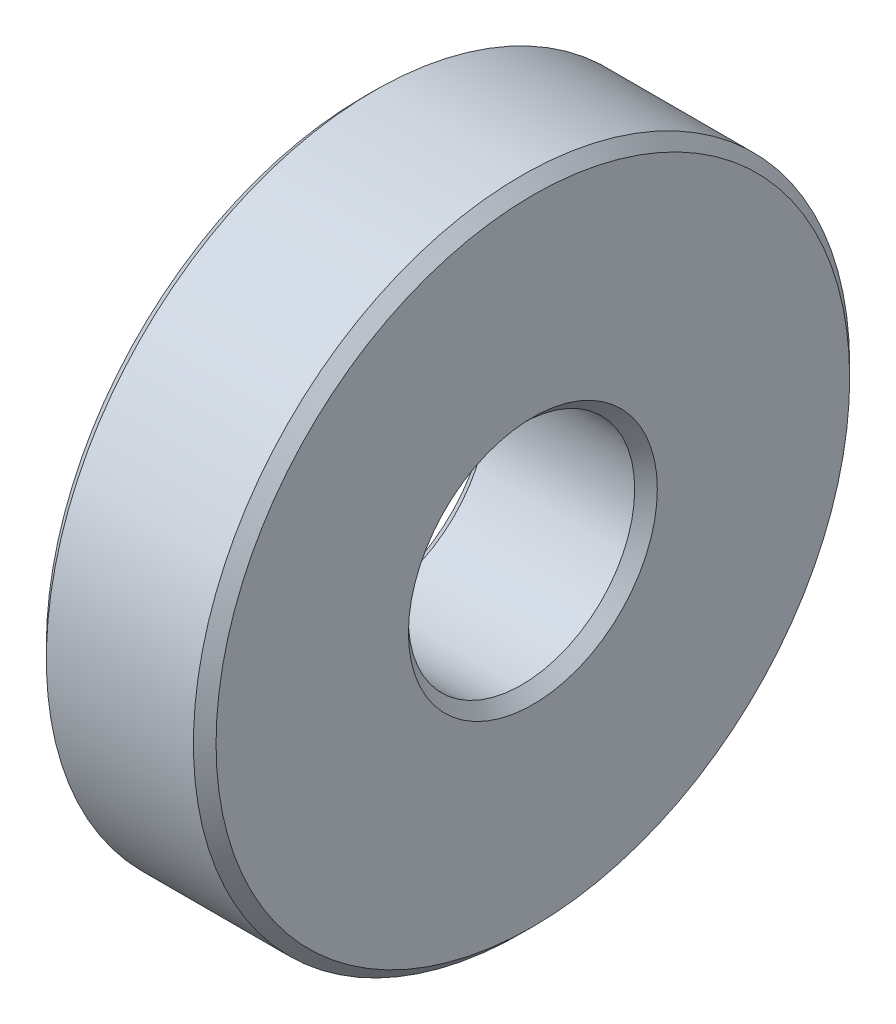
ISO-10303-21;
HEADER;
FILE_DESCRIPTION(('STEP AP214'),'2;1');
FILE_NAME('part.step','',(''),(''),'','','');
FILE_SCHEMA(('AUTOMOTIVE_DESIGN { 1 0 10303 214 1 1 1 1 }'));
ENDSEC;
DATA;
#1=APPLICATION_CONTEXT('core data for automotive mechanical design processes');
#2=APPLICATION_PROTOCOL_DEFINITION('international standard','automotive_design',2000,#1);
#3=PRODUCT_CONTEXT('',#1,'mechanical');
#4=PRODUCT('Part','Part','',(#3));
#5=PRODUCT_RELATED_PRODUCT_CATEGORY('part','',(#4));
#6=PRODUCT_DEFINITION_FORMATION('','',#4);
#7=PRODUCT_DEFINITION_CONTEXT('part definition',#1,'design');
#8=PRODUCT_DEFINITION('design','',#6,#7);
#9=PRODUCT_DEFINITION_SHAPE('','',#8);
#10=(LENGTH_UNIT() NAMED_UNIT(*) SI_UNIT(.MILLI.,.METRE.));
#11=(NAMED_UNIT(*) PLANE_ANGLE_UNIT() SI_UNIT($,.RADIAN.));
#12=(NAMED_UNIT(*) SI_UNIT($,.STERADIAN.) SOLID_ANGLE_UNIT());
#13=UNCERTAINTY_MEASURE_WITH_UNIT(LENGTH_MEASURE(1.E-05),#10,'distance_accuracy_value','');
#14=(GEOMETRIC_REPRESENTATION_CONTEXT(3) GLOBAL_UNCERTAINTY_ASSIGNED_CONTEXT((#13)) GLOBAL_UNIT_ASSIGNED_CONTEXT((#10,
#11,#12)) REPRESENTATION_CONTEXT('',''));
#15=CARTESIAN_POINT('',(0.,0.,0.));
#16=DIRECTION('',(0.,0.,1.));
#17=DIRECTION('',(1.,0.,0.));
#18=AXIS2_PLACEMENT_3D('',#15,#16,#17);
#19=CARTESIAN_POINT('',(1.5,0.,0.));
#20=DIRECTION('',(1.,0.,0.));
#21=DIRECTION('',(0.,0.,-1.));
#22=AXIS2_PLACEMENT_3D('',#19,#20,#21);
#23=PLANE('',#22);
#24=CARTESIAN_POINT('',(1.5,0.,0.));
#25=DIRECTION('',(1.,0.,0.));
#26=DIRECTION('',(0.,0.,-1.));
#27=AXIS2_PLACEMENT_3D('',#24,#25,#26);
#28=CIRCLE('',#27,2.8);
#29=CARTESIAN_POINT('',(1.5,0.,-2.8));
#30=VERTEX_POINT('',#29);
#31=EDGE_CURVE('E10',#30,#30,#28,.T.);
#32=ORIENTED_EDGE('',*,*,#31,.T.);
#33=EDGE_LOOP('',(#32));
#34=FACE_BOUND('',#33,.T.);
#35=CARTESIAN_POINT('',(1.5,0.,0.));
#36=DIRECTION('',(1.,0.,0.));
#37=DIRECTION('',(0.,0.,-1.));
#38=AXIS2_PLACEMENT_3D('',#35,#36,#37);
#39=CIRCLE('',#38,1.1);
#40=CARTESIAN_POINT('',(1.5,0.,-1.1));
#41=VERTEX_POINT('',#40);
#42=EDGE_CURVE('E38',#41,#41,#39,.F.);
#43=ORIENTED_EDGE('',*,*,#42,.T.);
#44=EDGE_LOOP('',(#43));
#45=FACE_BOUND('',#44,.T.);
#46=ADVANCED_FACE('F31',(#34,#45),#23,.T.);
#47=CARTESIAN_POINT('',(0.,0.,0.));
#48=DIRECTION('',(1.,0.,0.));
#49=DIRECTION('',(0.,0.,-1.));
#50=AXIS2_PLACEMENT_3D('',#47,#48,#49);
#51=PLANE('',#50);
#52=CARTESIAN_POINT('',(0.,0.,0.));
#53=DIRECTION('',(1.,0.,0.));
#54=DIRECTION('',(0.,0.,-1.));
#55=AXIS2_PLACEMENT_3D('',#52,#53,#54);
#56=CIRCLE('',#55,2.8);
#57=CARTESIAN_POINT('',(0.,0.,-2.8));
#58=VERTEX_POINT('',#57);
#59=EDGE_CURVE('E51',#58,#58,#56,.F.);
#60=ORIENTED_EDGE('',*,*,#59,.T.);
#61=EDGE_LOOP('',(#60));
#62=FACE_BOUND('',#61,.T.);
#63=CARTESIAN_POINT('',(0.,0.,0.));
#64=DIRECTION('',(1.,0.,0.));
#65=DIRECTION('',(0.,0.,-1.));
#66=AXIS2_PLACEMENT_3D('',#63,#64,#65);
#67=CIRCLE('',#66,1.1);
#68=CARTESIAN_POINT('',(0.,0.,-1.1));
#69=VERTEX_POINT('',#68);
#70=EDGE_CURVE('E54',#69,#69,#67,.T.);
#71=ORIENTED_EDGE('',*,*,#70,.T.);
#72=EDGE_LOOP('',(#71));
#73=FACE_BOUND('',#72,.T.);
#74=ADVANCED_FACE('F79',(#62,#73),#51,.F.);
#75=CARTESIAN_POINT('',(1.5,0.,0.));
#76=DIRECTION('',(-1.,0.,0.));
#77=DIRECTION('',(0.,0.,1.));
#78=AXIS2_PLACEMENT_3D('',#75,#76,#77);
#79=CYLINDRICAL_SURFACE('',#78,2.9);
#80=CARTESIAN_POINT('',(0.0999999999999985,0.,0.));
#81=DIRECTION('',(1.,0.,0.));
#82=DIRECTION('',(0.,0.,-1.));
#83=AXIS2_PLACEMENT_3D('',#80,#81,#82);
#84=CIRCLE('',#83,2.9);
#85=CARTESIAN_POINT('',(0.0999999999999985,0.,-2.9));
#86=VERTEX_POINT('',#85);
#87=EDGE_CURVE('E57',#86,#86,#84,.T.);
#88=ORIENTED_EDGE('',*,*,#87,.T.);
#89=EDGE_LOOP('',(#88));
#90=FACE_BOUND('',#89,.T.);
#91=CARTESIAN_POINT('',(1.4,0.,0.));
#92=DIRECTION('',(1.,0.,0.));
#93=DIRECTION('',(0.,0.,-1.));
#94=AXIS2_PLACEMENT_3D('',#91,#92,#93);
#95=CIRCLE('',#94,2.9);
#96=CARTESIAN_POINT('',(1.4,0.,-2.9));
#97=VERTEX_POINT('',#96);
#98=EDGE_CURVE('E60',#97,#97,#95,.F.);
#99=ORIENTED_EDGE('',*,*,#98,.T.);
#100=EDGE_LOOP('',(#99));
#101=FACE_BOUND('',#100,.T.);
#102=ADVANCED_FACE('F64',(#90,#101),#79,.T.);
#103=CARTESIAN_POINT('',(1.5,0.,0.));
#104=DIRECTION('',(-1.,0.,0.));
#105=DIRECTION('',(0.,0.,1.));
#106=AXIS2_PLACEMENT_3D('',#103,#104,#105);
#107=CYLINDRICAL_SURFACE('',#106,1.);
#108=CARTESIAN_POINT('',(0.0999999999999994,0.,0.));
#109=DIRECTION('',(1.,0.,0.));
#110=DIRECTION('',(0.,0.,-1.));
#111=AXIS2_PLACEMENT_3D('',#108,#109,#110);
#112=CIRCLE('',#111,1.);
#113=CARTESIAN_POINT('',(0.0999999999999994,0.,-1.));
#114=VERTEX_POINT('',#113);
#115=EDGE_CURVE('E42',#114,#114,#112,.F.);
#116=ORIENTED_EDGE('',*,*,#115,.T.);
#117=EDGE_LOOP('',(#116));
#118=FACE_BOUND('',#117,.T.);
#119=CARTESIAN_POINT('',(1.4,0.,0.));
#120=DIRECTION('',(1.,0.,0.));
#121=DIRECTION('',(0.,0.,-1.));
#122=AXIS2_PLACEMENT_3D('',#119,#120,#121);
#123=CIRCLE('',#122,1.);
#124=CARTESIAN_POINT('',(1.4,0.,-1.));
#125=VERTEX_POINT('',#124);
#126=EDGE_CURVE('E46',#125,#125,#123,.T.);
#127=ORIENTED_EDGE('',*,*,#126,.T.);
#128=EDGE_LOOP('',(#127));
#129=FACE_BOUND('',#128,.T.);
#130=ADVANCED_FACE('F87',(#118,#129),#107,.F.);
#131=CARTESIAN_POINT('',(0.0999999999999985,0.,0.));
#132=DIRECTION('',(1.,0.,0.));
#133=DIRECTION('',(0.,0.,-1.));
#134=AXIS2_PLACEMENT_3D('',#131,#132,#133);
#135=CONICAL_SURFACE('',#134,2.9,0.785398163397453);
#136=ORIENTED_EDGE('',*,*,#59,.F.);
#137=EDGE_LOOP('',(#136));
#138=FACE_BOUND('',#137,.T.);
#139=ORIENTED_EDGE('',*,*,#87,.F.);
#140=EDGE_LOOP('',(#139));
#141=FACE_BOUND('',#140,.T.);
#142=ADVANCED_FACE('F75',(#138,#141),#135,.T.);
#143=CARTESIAN_POINT('',(0.,0.,0.));
#144=DIRECTION('',(-1.,0.,0.));
#145=DIRECTION('',(0.,0.,1.));
#146=AXIS2_PLACEMENT_3D('',#143,#144,#145);
#147=CONICAL_SURFACE('',#146,1.1,0.785398163397448);
#148=ORIENTED_EDGE('',*,*,#115,.F.);
#149=EDGE_LOOP('',(#148));
#150=FACE_BOUND('',#149,.T.);
#151=ORIENTED_EDGE('',*,*,#70,.F.);
#152=EDGE_LOOP('',(#151));
#153=FACE_BOUND('',#152,.T.);
#154=ADVANCED_FACE('F69',(#150,#153),#147,.F.);
#155=CARTESIAN_POINT('',(1.5,0.,0.));
#156=DIRECTION('',(-1.,0.,0.));
#157=DIRECTION('',(0.,0.,1.));
#158=AXIS2_PLACEMENT_3D('',#155,#156,#157);
#159=CONICAL_SURFACE('',#158,2.8,0.785398163397444);
#160=ORIENTED_EDGE('',*,*,#98,.F.);
#161=EDGE_LOOP('',(#160));
#162=FACE_BOUND('',#161,.T.);
#163=ORIENTED_EDGE('',*,*,#31,.F.);
#164=EDGE_LOOP('',(#163));
#165=FACE_BOUND('',#164,.T.);
#166=ADVANCED_FACE('F66',(#162,#165),#159,.T.);
#167=CARTESIAN_POINT('',(1.4,0.,0.));
#168=DIRECTION('',(1.,0.,0.));
#169=DIRECTION('',(0.,0.,-1.));
#170=AXIS2_PLACEMENT_3D('',#167,#168,#169);
#171=CONICAL_SURFACE('',#170,1.,0.785398163397453);
#172=ORIENTED_EDGE('',*,*,#42,.F.);
#173=EDGE_LOOP('',(#172));
#174=FACE_BOUND('',#173,.T.);
#175=ORIENTED_EDGE('',*,*,#126,.F.);
#176=EDGE_LOOP('',(#175));
#177=FACE_BOUND('',#176,.T.);
#178=ADVANCED_FACE('F33',(#174,#177),#171,.F.);
#179=CLOSED_SHELL('',(#46,#74,#102,#130,#142,#154,#166,#178));
#180=MANIFOLD_SOLID_BREP('B2',#179);
#181=ADVANCED_BREP_SHAPE_REPRESENTATION('',(#18,#180),#14);
#182=SHAPE_DEFINITION_REPRESENTATION(#9,#181);
ENDSEC;
END-ISO-10303-21;
